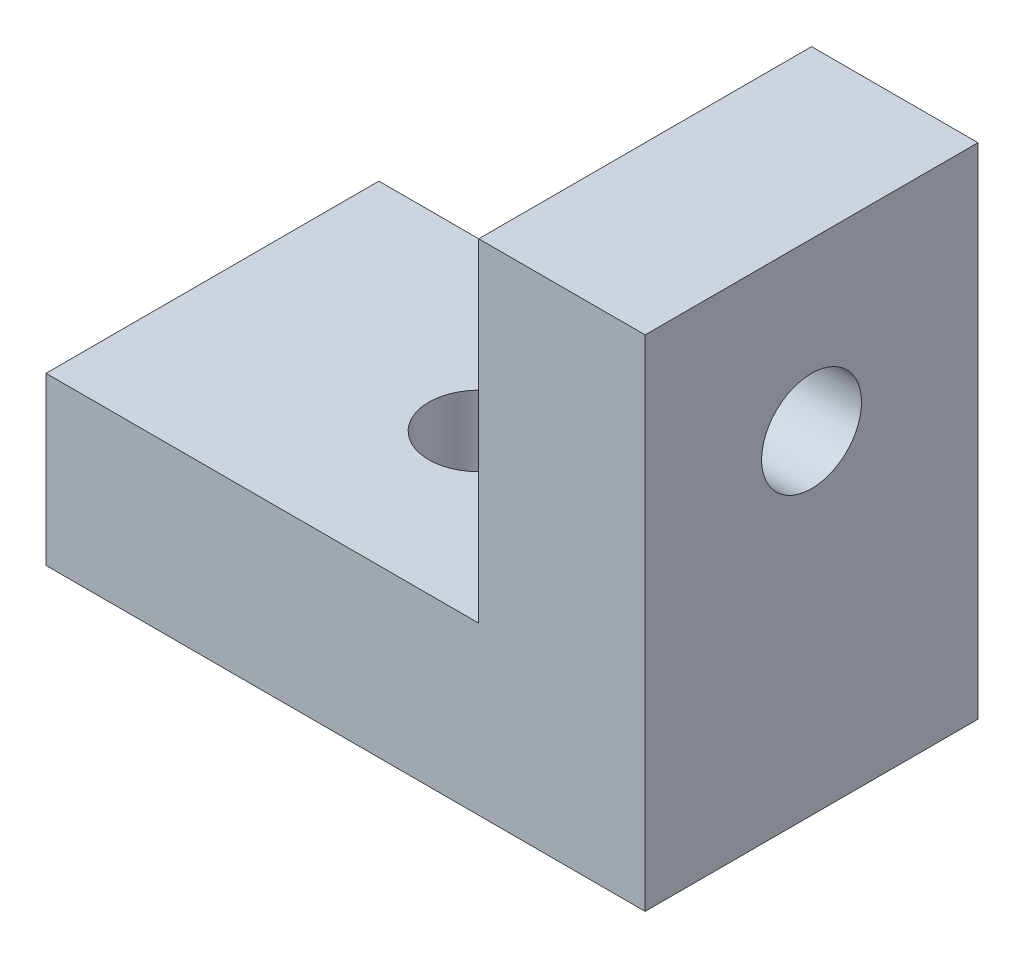
ISO-10303-21;
HEADER;
FILE_DESCRIPTION(('STEP AP214'),'2;1');
FILE_NAME('part.step','',(''),(''),'','','');
FILE_SCHEMA(('AUTOMOTIVE_DESIGN { 1 0 10303 214 1 1 1 1 }'));
ENDSEC;
DATA;
#1=APPLICATION_CONTEXT('core data for automotive mechanical design processes');
#2=APPLICATION_PROTOCOL_DEFINITION('international standard','automotive_design',2000,#1);
#3=PRODUCT_CONTEXT('',#1,'mechanical');
#4=PRODUCT('Part','Part','',(#3));
#5=PRODUCT_RELATED_PRODUCT_CATEGORY('part','',(#4));
#6=PRODUCT_DEFINITION_FORMATION('','',#4);
#7=PRODUCT_DEFINITION_CONTEXT('part definition',#1,'design');
#8=PRODUCT_DEFINITION('design','',#6,#7);
#9=PRODUCT_DEFINITION_SHAPE('','',#8);
#10=(LENGTH_UNIT() NAMED_UNIT(*) SI_UNIT(.MILLI.,.METRE.));
#11=(NAMED_UNIT(*) PLANE_ANGLE_UNIT() SI_UNIT($,.RADIAN.));
#12=(NAMED_UNIT(*) SI_UNIT($,.STERADIAN.) SOLID_ANGLE_UNIT());
#13=UNCERTAINTY_MEASURE_WITH_UNIT(LENGTH_MEASURE(1.E-05),#10,'distance_accuracy_value','');
#14=(GEOMETRIC_REPRESENTATION_CONTEXT(3) GLOBAL_UNCERTAINTY_ASSIGNED_CONTEXT((#13)) GLOBAL_UNIT_ASSIGNED_CONTEXT((#10,
#11,#12)) REPRESENTATION_CONTEXT('',''));
#15=CARTESIAN_POINT('',(0.,0.,0.));
#16=DIRECTION('',(0.,0.,1.));
#17=DIRECTION('',(1.,0.,0.));
#18=AXIS2_PLACEMENT_3D('',#15,#16,#17);
#19=CARTESIAN_POINT('',(-5.,15.,10.));
#20=DIRECTION('',(1.,0.,0.));
#21=DIRECTION('',(0.,1.,0.));
#22=AXIS2_PLACEMENT_3D('',#19,#20,#21);
#23=PLANE('',#22);
#24=DIRECTION('',(0.,-1.,0.));
#25=VECTOR('',#24,1.);
#26=CARTESIAN_POINT('',(-5.,15.,0.));
#27=LINE('',#26,#25);
#28=CARTESIAN_POINT('',(-5.,15.,0.));
#29=VERTEX_POINT('',#28);
#30=CARTESIAN_POINT('',(-5.,5.,0.));
#31=VERTEX_POINT('',#30);
#32=EDGE_CURVE('E126',#29,#31,#27,.T.);
#33=ORIENTED_EDGE('',*,*,#32,.T.);
#34=DIRECTION('',(0.,0.,-1.));
#35=VECTOR('',#34,1.);
#36=CARTESIAN_POINT('',(-5.,5.,10.));
#37=LINE('',#36,#35);
#38=CARTESIAN_POINT('',(-5.,5.,10.));
#39=VERTEX_POINT('',#38);
#40=EDGE_CURVE('E123',#39,#31,#37,.T.);
#41=ORIENTED_EDGE('',*,*,#40,.F.);
#42=DIRECTION('',(0.,-1.,0.));
#43=VECTOR('',#42,1.);
#44=CARTESIAN_POINT('',(-5.,15.,10.));
#45=LINE('',#44,#43);
#46=CARTESIAN_POINT('',(-5.,15.,10.));
#47=VERTEX_POINT('',#46);
#48=EDGE_CURVE('E109',#47,#39,#45,.T.);
#49=ORIENTED_EDGE('',*,*,#48,.F.);
#50=DIRECTION('',(0.,0.,-1.));
#51=VECTOR('',#50,1.);
#52=CARTESIAN_POINT('',(-5.,15.,10.));
#53=LINE('',#52,#51);
#54=EDGE_CURVE('E130',#47,#29,#53,.T.);
#55=ORIENTED_EDGE('',*,*,#54,.T.);
#56=EDGE_LOOP('',(#33,#41,#49,#55));
#57=FACE_BOUND('',#56,.T.);
#58=DIRECTION('',(0.,-0.5,-0.866025403784438));
#59=VECTOR('',#58,1.);
#60=CARTESIAN_POINT('',(-5.,11.0334936490539,12.2900635094611));
#61=LINE('',#60,#59);
#62=CARTESIAN_POINT('',(-5.,8.41228675972853,7.75));
#63=VERTEX_POINT('',#62);
#64=CARTESIAN_POINT('',(-5.,6.82457351945706,5.));
#65=VERTEX_POINT('',#64);
#66=EDGE_CURVE('E55',#63,#65,#61,.T.);
#67=ORIENTED_EDGE('',*,*,#66,.T.);
#68=DIRECTION('',(0.,0.5,-0.866025403784439));
#69=VECTOR('',#68,1.);
#70=CARTESIAN_POINT('',(-5.,6.7033666301317,5.2099364905389));
#71=LINE('',#70,#69);
#72=CARTESIAN_POINT('',(-5.,8.41228675972853,2.25));
#73=VERTEX_POINT('',#72);
#74=EDGE_CURVE('E226',#65,#73,#71,.T.);
#75=ORIENTED_EDGE('',*,*,#74,.T.);
#76=DIRECTION('',(0.,1.,0.));
#77=VECTOR('',#76,1.);
#78=CARTESIAN_POINT('',(-5.,15.,2.25));
#79=LINE('',#78,#77);
#80=CARTESIAN_POINT('',(-5.,11.5877132402715,2.25));
#81=VERTEX_POINT('',#80);
#82=EDGE_CURVE('E222',#73,#81,#79,.T.);
#83=ORIENTED_EDGE('',*,*,#82,.T.);
#84=DIRECTION('',(0.,0.5,0.866025403784439));
#85=VECTOR('',#84,1.);
#86=CARTESIAN_POINT('',(-5.,15.7966333698683,9.5400635094611));
#87=LINE('',#86,#85);
#88=CARTESIAN_POINT('',(-5.,13.1754264805429,5.));
#89=VERTEX_POINT('',#88);
#90=EDGE_CURVE('E218',#81,#89,#87,.T.);
#91=ORIENTED_EDGE('',*,*,#90,.T.);
#92=DIRECTION('',(0.,-0.5,0.866025403784438));
#93=VECTOR('',#92,1.);
#94=CARTESIAN_POINT('',(-5.,11.4665063509461,7.9599364905389));
#95=LINE('',#94,#93);
#96=CARTESIAN_POINT('',(-5.,11.5877132402715,7.75));
#97=VERTEX_POINT('',#96);
#98=EDGE_CURVE('E214',#89,#97,#95,.T.);
#99=ORIENTED_EDGE('',*,*,#98,.T.);
#100=DIRECTION('',(0.,-1.,0.));
#101=VECTOR('',#100,1.);
#102=CARTESIAN_POINT('',(-5.,15.,7.75));
#103=LINE('',#102,#101);
#104=EDGE_CURVE('E209',#97,#63,#103,.T.);
#105=ORIENTED_EDGE('',*,*,#104,.T.);
#106=EDGE_LOOP('',(#67,#75,#83,#91,#99,#105));
#107=FACE_BOUND('',#106,.T.);
#108=ADVANCED_FACE('F39',(#57,#107),#23,.F.);
#109=CARTESIAN_POINT('',(-18.,0.,10.));
#110=DIRECTION('',(0.,1.,0.));
#111=DIRECTION('',(0.,0.,1.));
#112=AXIS2_PLACEMENT_3D('',#109,#110,#111);
#113=PLANE('',#112);
#114=CARTESIAN_POINT('',(-10.,0.,5.));
#115=DIRECTION('',(0.,1.,0.));
#116=DIRECTION('',(0.,0.,1.));
#117=AXIS2_PLACEMENT_3D('',#114,#115,#116);
#118=CIRCLE('',#117,1.5);
#119=CARTESIAN_POINT('',(-11.5,0.,5.));
#120=VERTEX_POINT('',#119);
#121=EDGE_CURVE('E258',#120,#120,#118,.F.);
#122=ORIENTED_EDGE('',*,*,#121,.F.);
#123=EDGE_LOOP('',(#122));
#124=FACE_BOUND('',#123,.T.);
#125=DIRECTION('',(1.,0.,0.));
#126=VECTOR('',#125,1.);
#127=CARTESIAN_POINT('',(-18.,0.,0.));
#128=LINE('',#127,#126);
#129=CARTESIAN_POINT('',(-18.,0.,0.));
#130=VERTEX_POINT('',#129);
#131=CARTESIAN_POINT('',(0.,0.,0.));
#132=VERTEX_POINT('',#131);
#133=EDGE_CURVE('E141',#130,#132,#128,.T.);
#134=ORIENTED_EDGE('',*,*,#133,.T.);
#135=DIRECTION('',(0.,0.,-1.));
#136=VECTOR('',#135,1.);
#137=CARTESIAN_POINT('',(0.,0.,10.));
#138=LINE('',#137,#136);
#139=CARTESIAN_POINT('',(0.,0.,10.));
#140=VERTEX_POINT('',#139);
#141=EDGE_CURVE('E11',#140,#132,#138,.T.);
#142=ORIENTED_EDGE('',*,*,#141,.F.);
#143=DIRECTION('',(1.,0.,0.));
#144=VECTOR('',#143,1.);
#145=CARTESIAN_POINT('',(-18.,0.,10.));
#146=LINE('',#145,#144);
#147=CARTESIAN_POINT('',(-18.,0.,10.));
#148=VERTEX_POINT('',#147);
#149=EDGE_CURVE('E159',#148,#140,#146,.T.);
#150=ORIENTED_EDGE('',*,*,#149,.F.);
#151=DIRECTION('',(0.,0.,-1.));
#152=VECTOR('',#151,1.);
#153=CARTESIAN_POINT('',(-18.,0.,10.));
#154=LINE('',#153,#152);
#155=EDGE_CURVE('E137',#148,#130,#154,.T.);
#156=ORIENTED_EDGE('',*,*,#155,.T.);
#157=EDGE_LOOP('',(#134,#142,#150,#156));
#158=FACE_BOUND('',#157,.T.);
#159=ADVANCED_FACE('F41',(#124,#158),#113,.F.);
#160=CARTESIAN_POINT('',(0.,0.,10.));
#161=DIRECTION('',(-1.,0.,0.));
#162=DIRECTION('',(0.,0.,1.));
#163=AXIS2_PLACEMENT_3D('',#160,#161,#162);
#164=PLANE('',#163);
#165=CARTESIAN_POINT('',(0.,10.,5.));
#166=DIRECTION('',(1.,0.,0.));
#167=DIRECTION('',(0.,0.,-1.));
#168=AXIS2_PLACEMENT_3D('',#165,#166,#167);
#169=CIRCLE('',#168,1.5);
#170=CARTESIAN_POINT('',(0.,10.,3.5));
#171=VERTEX_POINT('',#170);
#172=EDGE_CURVE('E146',#171,#171,#169,.T.);
#173=ORIENTED_EDGE('',*,*,#172,.F.);
#174=EDGE_LOOP('',(#173));
#175=FACE_BOUND('',#174,.T.);
#176=DIRECTION('',(0.,1.,0.));
#177=VECTOR('',#176,1.);
#178=CARTESIAN_POINT('',(0.,0.,0.));
#179=LINE('',#178,#177);
#180=CARTESIAN_POINT('',(0.,15.,0.));
#181=VERTEX_POINT('',#180);
#182=EDGE_CURVE('E145',#132,#181,#179,.T.);
#183=ORIENTED_EDGE('',*,*,#182,.T.);
#184=DIRECTION('',(0.,0.,-1.));
#185=VECTOR('',#184,1.);
#186=CARTESIAN_POINT('',(0.,15.,10.));
#187=LINE('',#186,#185);
#188=CARTESIAN_POINT('',(0.,15.,10.));
#189=VERTEX_POINT('',#188);
#190=EDGE_CURVE('E48',#189,#181,#187,.T.);
#191=ORIENTED_EDGE('',*,*,#190,.F.);
#192=DIRECTION('',(0.,1.,0.));
#193=VECTOR('',#192,1.);
#194=CARTESIAN_POINT('',(0.,0.,10.));
#195=LINE('',#194,#193);
#196=EDGE_CURVE('E99',#140,#189,#195,.T.);
#197=ORIENTED_EDGE('',*,*,#196,.F.);
#198=ORIENTED_EDGE('',*,*,#141,.T.);
#199=EDGE_LOOP('',(#183,#191,#197,#198));
#200=FACE_BOUND('',#199,.T.);
#201=ADVANCED_FACE('F277',(#175,#200),#164,.F.);
#202=CARTESIAN_POINT('',(0.,15.,10.));
#203=DIRECTION('',(0.,-1.,0.));
#204=DIRECTION('',(0.,0.,-1.));
#205=AXIS2_PLACEMENT_3D('',#202,#203,#204);
#206=PLANE('',#205);
#207=DIRECTION('',(-1.,0.,0.));
#208=VECTOR('',#207,1.);
#209=CARTESIAN_POINT('',(0.,15.,0.));
#210=LINE('',#209,#208);
#211=EDGE_CURVE('E149',#181,#29,#210,.T.);
#212=ORIENTED_EDGE('',*,*,#211,.T.);
#213=ORIENTED_EDGE('',*,*,#54,.F.);
#214=DIRECTION('',(-1.,0.,0.));
#215=VECTOR('',#214,1.);
#216=CARTESIAN_POINT('',(0.,15.,10.));
#217=LINE('',#216,#215);
#218=EDGE_CURVE('E116',#189,#47,#217,.T.);
#219=ORIENTED_EDGE('',*,*,#218,.F.);
#220=ORIENTED_EDGE('',*,*,#190,.T.);
#221=EDGE_LOOP('',(#212,#213,#219,#220));
#222=FACE_BOUND('',#221,.T.);
#223=ADVANCED_FACE('F169',(#222),#206,.F.);
#224=CARTESIAN_POINT('',(-5.,5.,10.));
#225=DIRECTION('',(0.,-1.,0.));
#226=DIRECTION('',(1.,0.,0.));
#227=AXIS2_PLACEMENT_3D('',#224,#225,#226);
#228=PLANE('',#227);
#229=CARTESIAN_POINT('',(-10.,5.,5.));
#230=DIRECTION('',(0.,1.,0.));
#231=DIRECTION('',(-1.,0.,0.));
#232=AXIS2_PLACEMENT_3D('',#229,#230,#231);
#233=CIRCLE('',#232,1.5);
#234=CARTESIAN_POINT('',(-11.5,5.,5.));
#235=VERTEX_POINT('',#234);
#236=EDGE_CURVE('E262',#235,#235,#233,.T.);
#237=ORIENTED_EDGE('',*,*,#236,.F.);
#238=EDGE_LOOP('',(#237));
#239=FACE_BOUND('',#238,.T.);
#240=DIRECTION('',(-1.,0.,0.));
#241=VECTOR('',#240,1.);
#242=CARTESIAN_POINT('',(-5.,5.,0.));
#243=LINE('',#242,#241);
#244=CARTESIAN_POINT('',(-18.,5.,0.));
#245=VERTEX_POINT('',#244);
#246=EDGE_CURVE('E154',#31,#245,#243,.T.);
#247=ORIENTED_EDGE('',*,*,#246,.T.);
#248=DIRECTION('',(0.,0.,-1.));
#249=VECTOR('',#248,1.);
#250=CARTESIAN_POINT('',(-18.,5.,10.));
#251=LINE('',#250,#249);
#252=CARTESIAN_POINT('',(-18.,5.,10.));
#253=VERTEX_POINT('',#252);
#254=EDGE_CURVE('E131',#253,#245,#251,.T.);
#255=ORIENTED_EDGE('',*,*,#254,.F.);
#256=DIRECTION('',(-1.,0.,0.));
#257=VECTOR('',#256,1.);
#258=CARTESIAN_POINT('',(-5.,5.,10.));
#259=LINE('',#258,#257);
#260=EDGE_CURVE('E113',#39,#253,#259,.T.);
#261=ORIENTED_EDGE('',*,*,#260,.F.);
#262=ORIENTED_EDGE('',*,*,#40,.T.);
#263=EDGE_LOOP('',(#247,#255,#261,#262));
#264=FACE_BOUND('',#263,.T.);
#265=ADVANCED_FACE('F133',(#239,#264),#228,.F.);
#266=CARTESIAN_POINT('',(-18.,5.,10.));
#267=DIRECTION('',(1.,0.,0.));
#268=DIRECTION('',(0.,0.,-1.));
#269=AXIS2_PLACEMENT_3D('',#266,#267,#268);
#270=PLANE('',#269);
#271=DIRECTION('',(0.,-1.,0.));
#272=VECTOR('',#271,1.);
#273=CARTESIAN_POINT('',(-18.,5.,0.));
#274=LINE('',#273,#272);
#275=EDGE_CURVE('E91',#245,#130,#274,.T.);
#276=ORIENTED_EDGE('',*,*,#275,.T.);
#277=ORIENTED_EDGE('',*,*,#155,.F.);
#278=DIRECTION('',(0.,-1.,0.));
#279=VECTOR('',#278,1.);
#280=CARTESIAN_POINT('',(-18.,5.,10.));
#281=LINE('',#280,#279);
#282=EDGE_CURVE('E64',#253,#148,#281,.T.);
#283=ORIENTED_EDGE('',*,*,#282,.F.);
#284=ORIENTED_EDGE('',*,*,#254,.T.);
#285=EDGE_LOOP('',(#276,#277,#283,#284));
#286=FACE_BOUND('',#285,.T.);
#287=ADVANCED_FACE('F173',(#286),#270,.F.);
#288=CARTESIAN_POINT('',(0.,0.,10.));
#289=DIRECTION('',(0.,0.,1.));
#290=DIRECTION('',(1.,0.,0.));
#291=AXIS2_PLACEMENT_3D('',#288,#289,#290);
#292=PLANE('',#291);
#293=ORIENTED_EDGE('',*,*,#149,.T.);
#294=ORIENTED_EDGE('',*,*,#196,.T.);
#295=ORIENTED_EDGE('',*,*,#218,.T.);
#296=ORIENTED_EDGE('',*,*,#48,.T.);
#297=ORIENTED_EDGE('',*,*,#260,.T.);
#298=ORIENTED_EDGE('',*,*,#282,.T.);
#299=EDGE_LOOP('',(#293,#294,#295,#296,#297,#298));
#300=FACE_BOUND('',#299,.T.);
#301=ADVANCED_FACE('F111',(#300),#292,.T.);
#302=CARTESIAN_POINT('',(0.,0.,0.));
#303=DIRECTION('',(0.,0.,1.));
#304=DIRECTION('',(1.,0.,0.));
#305=AXIS2_PLACEMENT_3D('',#302,#303,#304);
#306=PLANE('',#305);
#307=ORIENTED_EDGE('',*,*,#133,.F.);
#308=ORIENTED_EDGE('',*,*,#275,.F.);
#309=ORIENTED_EDGE('',*,*,#246,.F.);
#310=ORIENTED_EDGE('',*,*,#32,.F.);
#311=ORIENTED_EDGE('',*,*,#211,.F.);
#312=ORIENTED_EDGE('',*,*,#182,.F.);
#313=EDGE_LOOP('',(#307,#308,#309,#310,#311,#312));
#314=FACE_BOUND('',#313,.T.);
#315=ADVANCED_FACE('F172',(#314),#306,.F.);
#316=CARTESIAN_POINT('',(-18.001,10.,5.));
#317=DIRECTION('',(1.,0.,0.));
#318=DIRECTION('',(0.,0.,-1.));
#319=AXIS2_PLACEMENT_3D('',#316,#317,#318);
#320=CYLINDRICAL_SURFACE('',#319,1.5);
#321=CARTESIAN_POINT('',(-3.,10.,5.));
#322=DIRECTION('',(1.,0.,0.));
#323=DIRECTION('',(0.,1.,0.));
#324=AXIS2_PLACEMENT_3D('',#321,#322,#323);
#325=CIRCLE('',#324,1.5);
#326=CARTESIAN_POINT('',(-3.,11.5,5.));
#327=VERTEX_POINT('',#326);
#328=EDGE_CURVE('E232',#327,#327,#325,.T.);
#329=ORIENTED_EDGE('',*,*,#328,.F.);
#330=EDGE_LOOP('',(#329));
#331=FACE_BOUND('',#330,.T.);
#332=ORIENTED_EDGE('',*,*,#172,.T.);
#333=EDGE_LOOP('',(#332));
#334=FACE_BOUND('',#333,.T.);
#335=ADVANCED_FACE('F291',(#331,#334),#320,.F.);
#336=CARTESIAN_POINT('',(-3.,0.,0.));
#337=DIRECTION('',(1.,0.,0.));
#338=DIRECTION('',(0.,1.,0.));
#339=AXIS2_PLACEMENT_3D('',#336,#337,#338);
#340=PLANE('',#339);
#341=DIRECTION('',(0.,-0.5,-0.866025403784438));
#342=VECTOR('',#341,1.);
#343=CARTESIAN_POINT('',(-3.,11.0334936490539,12.2900635094611));
#344=LINE('',#343,#342);
#345=CARTESIAN_POINT('',(-3.,8.41228675972853,7.75));
#346=VERTEX_POINT('',#345);
#347=CARTESIAN_POINT('',(-3.,6.82457351945706,5.));
#348=VERTEX_POINT('',#347);
#349=EDGE_CURVE('E213',#346,#348,#344,.T.);
#350=ORIENTED_EDGE('',*,*,#349,.F.);
#351=DIRECTION('',(0.,-1.,0.));
#352=VECTOR('',#351,1.);
#353=CARTESIAN_POINT('',(-3.,15.,7.75));
#354=LINE('',#353,#352);
#355=CARTESIAN_POINT('',(-3.,11.5877132402715,7.75));
#356=VERTEX_POINT('',#355);
#357=EDGE_CURVE('E208',#356,#346,#354,.T.);
#358=ORIENTED_EDGE('',*,*,#357,.F.);
#359=DIRECTION('',(0.,-0.5,0.866025403784438));
#360=VECTOR('',#359,1.);
#361=CARTESIAN_POINT('',(-3.,11.4665063509461,7.9599364905389));
#362=LINE('',#361,#360);
#363=CARTESIAN_POINT('',(-3.,13.1754264805429,5.));
#364=VERTEX_POINT('',#363);
#365=EDGE_CURVE('E236',#364,#356,#362,.T.);
#366=ORIENTED_EDGE('',*,*,#365,.F.);
#367=DIRECTION('',(0.,0.5,0.866025403784439));
#368=VECTOR('',#367,1.);
#369=CARTESIAN_POINT('',(-3.,15.7966333698683,9.5400635094611));
#370=LINE('',#369,#368);
#371=CARTESIAN_POINT('',(-3.,11.5877132402715,2.25));
#372=VERTEX_POINT('',#371);
#373=EDGE_CURVE('E240',#372,#364,#370,.T.);
#374=ORIENTED_EDGE('',*,*,#373,.F.);
#375=DIRECTION('',(0.,1.,0.));
#376=VECTOR('',#375,1.);
#377=CARTESIAN_POINT('',(-3.,15.,2.25));
#378=LINE('',#377,#376);
#379=CARTESIAN_POINT('',(-3.,8.41228675972853,2.25));
#380=VERTEX_POINT('',#379);
#381=EDGE_CURVE('E244',#380,#372,#378,.T.);
#382=ORIENTED_EDGE('',*,*,#381,.F.);
#383=DIRECTION('',(0.,0.5,-0.866025403784439));
#384=VECTOR('',#383,1.);
#385=CARTESIAN_POINT('',(-3.,6.7033666301317,5.2099364905389));
#386=LINE('',#385,#384);
#387=EDGE_CURVE('E248',#348,#380,#386,.T.);
#388=ORIENTED_EDGE('',*,*,#387,.F.);
#389=EDGE_LOOP('',(#350,#358,#366,#374,#382,#388));
#390=FACE_BOUND('',#389,.T.);
#391=ORIENTED_EDGE('',*,*,#328,.T.);
#392=EDGE_LOOP('',(#391));
#393=FACE_BOUND('',#392,.T.);
#394=ADVANCED_FACE('F293',(#390,#393),#340,.F.);
#395=CARTESIAN_POINT('',(-3.,11.0334936490539,12.2900635094611));
#396=DIRECTION('',(0.,0.866025403784438,-0.5));
#397=DIRECTION('',(0.,0.5,0.866025403784438));
#398=AXIS2_PLACEMENT_3D('',#395,#396,#397);
#399=PLANE('',#398);
#400=ORIENTED_EDGE('',*,*,#66,.F.);
#401=DIRECTION('',(-1.,0.,0.));
#402=VECTOR('',#401,1.);
#403=CARTESIAN_POINT('',(-3.,8.41228675972853,7.75));
#404=LINE('',#403,#402);
#405=EDGE_CURVE('E205',#346,#63,#404,.T.);
#406=ORIENTED_EDGE('',*,*,#405,.F.);
#407=ORIENTED_EDGE('',*,*,#349,.T.);
#408=DIRECTION('',(-1.,0.,0.));
#409=VECTOR('',#408,1.);
#410=CARTESIAN_POINT('',(-3.,6.82457351945706,5.));
#411=LINE('',#410,#409);
#412=EDGE_CURVE('E186',#348,#65,#411,.T.);
#413=ORIENTED_EDGE('',*,*,#412,.T.);
#414=EDGE_LOOP('',(#400,#406,#407,#413));
#415=FACE_BOUND('',#414,.T.);
#416=ADVANCED_FACE('F300',(#415),#399,.T.);
#417=CARTESIAN_POINT('',(-3.,6.7033666301317,5.2099364905389));
#418=DIRECTION('',(0.,0.866025403784439,0.5));
#419=DIRECTION('',(0.,-0.5,0.866025403784439));
#420=AXIS2_PLACEMENT_3D('',#417,#418,#419);
#421=PLANE('',#420);
#422=ORIENTED_EDGE('',*,*,#74,.F.);
#423=ORIENTED_EDGE('',*,*,#412,.F.);
#424=ORIENTED_EDGE('',*,*,#387,.T.);
#425=DIRECTION('',(-1.,0.,0.));
#426=VECTOR('',#425,1.);
#427=CARTESIAN_POINT('',(-3.,8.41228675972853,2.25));
#428=LINE('',#427,#426);
#429=EDGE_CURVE('E189',#380,#73,#428,.T.);
#430=ORIENTED_EDGE('',*,*,#429,.T.);
#431=EDGE_LOOP('',(#422,#423,#424,#430));
#432=FACE_BOUND('',#431,.T.);
#433=ADVANCED_FACE('F346',(#432),#421,.T.);
#434=CARTESIAN_POINT('',(-3.,15.,2.25));
#435=DIRECTION('',(0.,0.,1.));
#436=DIRECTION('',(1.,0.,0.));
#437=AXIS2_PLACEMENT_3D('',#434,#435,#436);
#438=PLANE('',#437);
#439=ORIENTED_EDGE('',*,*,#82,.F.);
#440=ORIENTED_EDGE('',*,*,#429,.F.);
#441=ORIENTED_EDGE('',*,*,#381,.T.);
#442=DIRECTION('',(-1.,0.,0.));
#443=VECTOR('',#442,1.);
#444=CARTESIAN_POINT('',(-3.,11.5877132402715,2.25));
#445=LINE('',#444,#443);
#446=EDGE_CURVE('E193',#372,#81,#445,.T.);
#447=ORIENTED_EDGE('',*,*,#446,.T.);
#448=EDGE_LOOP('',(#439,#440,#441,#447));
#449=FACE_BOUND('',#448,.T.);
#450=ADVANCED_FACE('F354',(#449),#438,.T.);
#451=CARTESIAN_POINT('',(-3.,15.7966333698683,9.5400635094611));
#452=DIRECTION('',(0.,-0.866025403784439,0.5));
#453=DIRECTION('',(0.,-0.5,-0.866025403784439));
#454=AXIS2_PLACEMENT_3D('',#451,#452,#453);
#455=PLANE('',#454);
#456=ORIENTED_EDGE('',*,*,#90,.F.);
#457=ORIENTED_EDGE('',*,*,#446,.F.);
#458=ORIENTED_EDGE('',*,*,#373,.T.);
#459=DIRECTION('',(-1.,0.,0.));
#460=VECTOR('',#459,1.);
#461=CARTESIAN_POINT('',(-3.,13.1754264805429,5.));
#462=LINE('',#461,#460);
#463=EDGE_CURVE('E197',#364,#89,#462,.T.);
#464=ORIENTED_EDGE('',*,*,#463,.T.);
#465=EDGE_LOOP('',(#456,#457,#458,#464));
#466=FACE_BOUND('',#465,.T.);
#467=ADVANCED_FACE('F363',(#466),#455,.T.);
#468=CARTESIAN_POINT('',(-3.,11.4665063509461,7.9599364905389));
#469=DIRECTION('',(0.,-0.866025403784438,-0.5));
#470=DIRECTION('',(0.,0.5,-0.866025403784438));
#471=AXIS2_PLACEMENT_3D('',#468,#469,#470);
#472=PLANE('',#471);
#473=ORIENTED_EDGE('',*,*,#98,.F.);
#474=ORIENTED_EDGE('',*,*,#463,.F.);
#475=ORIENTED_EDGE('',*,*,#365,.T.);
#476=DIRECTION('',(-1.,0.,0.));
#477=VECTOR('',#476,1.);
#478=CARTESIAN_POINT('',(-3.,11.5877132402715,7.75));
#479=LINE('',#478,#477);
#480=EDGE_CURVE('E201',#356,#97,#479,.T.);
#481=ORIENTED_EDGE('',*,*,#480,.T.);
#482=EDGE_LOOP('',(#473,#474,#475,#481));
#483=FACE_BOUND('',#482,.T.);
#484=ADVANCED_FACE('F373',(#483),#472,.T.);
#485=CARTESIAN_POINT('',(-3.,15.,7.75));
#486=DIRECTION('',(0.,0.,-1.));
#487=DIRECTION('',(-1.,0.,0.));
#488=AXIS2_PLACEMENT_3D('',#485,#486,#487);
#489=PLANE('',#488);
#490=ORIENTED_EDGE('',*,*,#104,.F.);
#491=ORIENTED_EDGE('',*,*,#480,.F.);
#492=ORIENTED_EDGE('',*,*,#357,.T.);
#493=ORIENTED_EDGE('',*,*,#405,.T.);
#494=EDGE_LOOP('',(#490,#491,#492,#493));
#495=FACE_BOUND('',#494,.T.);
#496=ADVANCED_FACE('F383',(#495),#489,.T.);
#497=CARTESIAN_POINT('',(-10.,-0.00100000000000187,5.));
#498=DIRECTION('',(0.,1.,0.));
#499=DIRECTION('',(-1.,0.,0.));
#500=AXIS2_PLACEMENT_3D('',#497,#498,#499);
#501=CYLINDRICAL_SURFACE('',#500,1.5);
#502=CARTESIAN_POINT('',(-11.5,5.,5.));
#503=CARTESIAN_POINT('',(-11.5,4.94791666666667,5.));
#504=CARTESIAN_POINT('',(-11.5,4.89583333333333,5.));
#505=CARTESIAN_POINT('',(-11.5,4.79166666666667,5.));
#506=CARTESIAN_POINT('',(-11.5,4.73958333333333,5.));
#507=CARTESIAN_POINT('',(-11.5,4.63541666666667,5.));
#508=CARTESIAN_POINT('',(-11.5,4.58333333333333,5.));
#509=CARTESIAN_POINT('',(-11.5,4.47916666666667,5.));
#510=CARTESIAN_POINT('',(-11.5,4.42708333333333,5.));
#511=CARTESIAN_POINT('',(-11.5,4.32291666666667,5.));
#512=CARTESIAN_POINT('',(-11.5,4.27083333333333,5.));
#513=CARTESIAN_POINT('',(-11.5,4.16666666666667,5.));
#514=CARTESIAN_POINT('',(-11.5,4.11458333333333,5.));
#515=CARTESIAN_POINT('',(-11.5,4.01041666666667,5.));
#516=CARTESIAN_POINT('',(-11.5,3.95833333333333,5.));
#517=CARTESIAN_POINT('',(-11.5,3.85416666666667,5.));
#518=CARTESIAN_POINT('',(-11.5,3.80208333333333,5.));
#519=CARTESIAN_POINT('',(-11.5,3.69791666666667,5.));
#520=CARTESIAN_POINT('',(-11.5,3.64583333333333,5.));
#521=CARTESIAN_POINT('',(-11.5,3.54166666666667,5.));
#522=CARTESIAN_POINT('',(-11.5,3.48958333333333,5.));
#523=CARTESIAN_POINT('',(-11.5,3.38541666666667,5.));
#524=CARTESIAN_POINT('',(-11.5,3.33333333333333,5.));
#525=CARTESIAN_POINT('',(-11.5,3.22916666666667,5.));
#526=CARTESIAN_POINT('',(-11.5,3.17708333333333,5.));
#527=CARTESIAN_POINT('',(-11.5,3.07291666666667,5.));
#528=CARTESIAN_POINT('',(-11.5,3.02083333333333,5.));
#529=CARTESIAN_POINT('',(-11.5,2.91666666666667,5.));
#530=CARTESIAN_POINT('',(-11.5,2.86458333333333,5.));
#531=CARTESIAN_POINT('',(-11.5,2.76041666666667,5.));
#532=CARTESIAN_POINT('',(-11.5,2.70833333333333,5.));
#533=CARTESIAN_POINT('',(-11.5,2.60416666666667,5.));
#534=CARTESIAN_POINT('',(-11.5,2.55208333333333,5.));
#535=CARTESIAN_POINT('',(-11.5,2.44791666666667,5.));
#536=CARTESIAN_POINT('',(-11.5,2.39583333333333,5.));
#537=CARTESIAN_POINT('',(-11.5,2.29166666666667,5.));
#538=CARTESIAN_POINT('',(-11.5,2.23958333333333,5.));
#539=CARTESIAN_POINT('',(-11.5,2.13541666666667,5.));
#540=CARTESIAN_POINT('',(-11.5,2.08333333333333,5.));
#541=CARTESIAN_POINT('',(-11.5,1.97916666666667,5.));
#542=CARTESIAN_POINT('',(-11.5,1.92708333333333,5.));
#543=CARTESIAN_POINT('',(-11.5,1.82291666666667,5.));
#544=CARTESIAN_POINT('',(-11.5,1.77083333333333,5.));
#545=CARTESIAN_POINT('',(-11.5,1.66666666666667,5.));
#546=CARTESIAN_POINT('',(-11.5,1.61458333333333,5.));
#547=CARTESIAN_POINT('',(-11.5,1.51041666666667,5.));
#548=CARTESIAN_POINT('',(-11.5,1.45833333333333,5.));
#549=CARTESIAN_POINT('',(-11.5,1.35416666666667,5.));
#550=CARTESIAN_POINT('',(-11.5,1.30208333333333,5.));
#551=CARTESIAN_POINT('',(-11.5,1.19791666666667,5.));
#552=CARTESIAN_POINT('',(-11.5,1.14583333333333,5.));
#553=CARTESIAN_POINT('',(-11.5,1.04166666666667,5.));
#554=CARTESIAN_POINT('',(-11.5,0.989583333333333,5.));
#555=CARTESIAN_POINT('',(-11.5,0.885416666666667,5.));
#556=CARTESIAN_POINT('',(-11.5,0.833333333333333,5.));
#557=CARTESIAN_POINT('',(-11.5,0.729166666666667,5.));
#558=CARTESIAN_POINT('',(-11.5,0.677083333333334,5.));
#559=CARTESIAN_POINT('',(-11.5,0.572916666666667,5.));
#560=CARTESIAN_POINT('',(-11.5,0.520833333333334,5.));
#561=CARTESIAN_POINT('',(-11.5,0.416666666666667,5.));
#562=CARTESIAN_POINT('',(-11.5,0.364583333333333,5.));
#563=CARTESIAN_POINT('',(-11.5,0.260416666666667,5.));
#564=CARTESIAN_POINT('',(-11.5,0.208333333333333,5.));
#565=CARTESIAN_POINT('',(-11.5,0.104166666666667,5.));
#566=CARTESIAN_POINT('',(-11.5,0.0520833333333332,5.));
#567=CARTESIAN_POINT('',(-11.5,0.,5.));
#568=B_SPLINE_CURVE_WITH_KNOTS('',3,(#502,#503,#504,#505,#506,#507,#508,#509,#510,#511,#512,
#513,#514,#515,#516,#517,#518,#519,#520,#521,#522,#523,#524,#525,#526,#527,#528,#529,#530,#531,
#532,#533,#534,#535,#536,#537,#538,#539,#540,#541,#542,#543,#544,#545,#546,#547,#548,#549,#550,
#551,#552,#553,#554,#555,#556,#557,#558,#559,#560,#561,#562,#563,#564,#565,#566,#567),
.UNSPECIFIED.,.F.,.F.,(4,2,2,2,2,2,2,2,2,2,2,2,2,2,2,2,2,2,2,2,2,2,2,2,2,2,2,2,2,2,2,2,4),(0.,
0.15625,0.3125,0.46875,0.625000000000001,0.781250000000001,0.937500000000001,1.09375,1.25,
1.40625,1.5625,1.71875,1.875,2.03125,2.1875,2.34375,2.5,2.65625,2.8125,2.96875,3.125,3.28125,
3.4375,3.59375,3.75,3.90625,4.0625,4.21875,4.375,4.53125,4.6875,4.84375,5.),.UNSPECIFIED.);
#569=EDGE_CURVE('BSEAM267',#235,#120,#568,.T.);
#570=ORIENTED_EDGE('',*,*,#236,.T.);
#571=ORIENTED_EDGE('',*,*,#121,.T.);
#572=ORIENTED_EDGE('',*,*,#569,.T.);
#573=ORIENTED_EDGE('',*,*,#569,.F.);
#574=EDGE_LOOP('',(#570,#572,#571,#573));
#575=FACE_BOUND('',#574,.T.);
#576=ADVANCED_FACE('F267',(#575),#501,.F.);
#577=CLOSED_SHELL('',(#108,#159,#201,#223,#265,#287,#301,#315,#335,#394,#416,#433,#450,#467,
#484,#496,#576));
#578=MANIFOLD_SOLID_BREP('B2',#577);
#579=ADVANCED_BREP_SHAPE_REPRESENTATION('',(#18,#578),#14);
#580=SHAPE_DEFINITION_REPRESENTATION(#9,#579);
ENDSEC;
END-ISO-10303-21;
